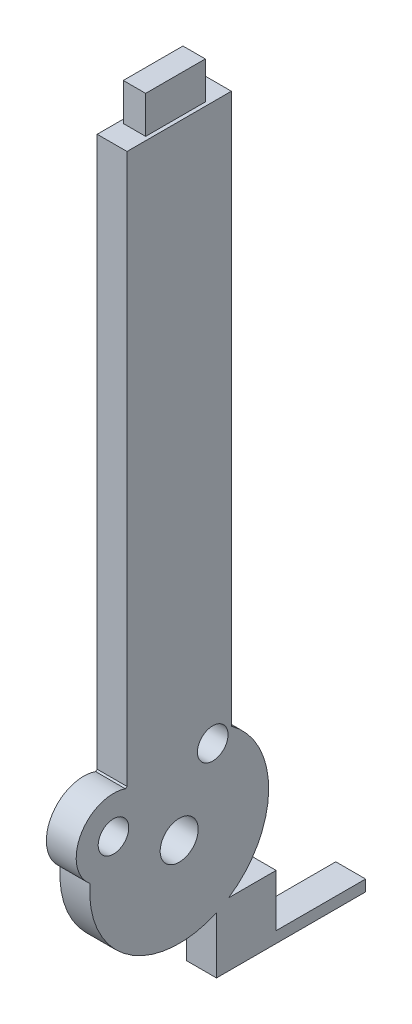
ISO-10303-21;
HEADER;
FILE_DESCRIPTION(('STEP AP214'),'2;1');
FILE_NAME('part.step','',(''),(''),'','','');
FILE_SCHEMA(('AUTOMOTIVE_DESIGN { 1 0 10303 214 1 1 1 1 }'));
ENDSEC;
DATA;
#1=APPLICATION_CONTEXT('core data for automotive mechanical design processes');
#2=APPLICATION_PROTOCOL_DEFINITION('international standard','automotive_design',2000,#1);
#3=PRODUCT_CONTEXT('',#1,'mechanical');
#4=PRODUCT('Part','Part','',(#3));
#5=PRODUCT_RELATED_PRODUCT_CATEGORY('part','',(#4));
#6=PRODUCT_DEFINITION_FORMATION('','',#4);
#7=PRODUCT_DEFINITION_CONTEXT('part definition',#1,'design');
#8=PRODUCT_DEFINITION('design','',#6,#7);
#9=PRODUCT_DEFINITION_SHAPE('','',#8);
#10=(LENGTH_UNIT() NAMED_UNIT(*) SI_UNIT(.MILLI.,.METRE.));
#11=(NAMED_UNIT(*) PLANE_ANGLE_UNIT() SI_UNIT($,.RADIAN.));
#12=(NAMED_UNIT(*) SI_UNIT($,.STERADIAN.) SOLID_ANGLE_UNIT());
#13=UNCERTAINTY_MEASURE_WITH_UNIT(LENGTH_MEASURE(1.E-05),#10,'distance_accuracy_value','');
#14=(GEOMETRIC_REPRESENTATION_CONTEXT(3) GLOBAL_UNCERTAINTY_ASSIGNED_CONTEXT((#13)) GLOBAL_UNIT_ASSIGNED_CONTEXT((#10,
#11,#12)) REPRESENTATION_CONTEXT('',''));
#15=CARTESIAN_POINT('',(0.,0.,0.));
#16=DIRECTION('',(0.,0.,1.));
#17=DIRECTION('',(1.,0.,0.));
#18=AXIS2_PLACEMENT_3D('',#15,#16,#17);
#19=CARTESIAN_POINT('',(-4.,-75.,6.));
#20=DIRECTION('',(1.,0.,0.));
#21=DIRECTION('',(0.,0.,-1.));
#22=AXIS2_PLACEMENT_3D('',#19,#20,#21);
#23=CYLINDRICAL_SURFACE('',#22,24.);
#24=DIRECTION('',(1.,0.,0.));
#25=VECTOR('',#24,1.);
#26=CARTESIAN_POINT('',(-4.,-96.8174242292714,-4.));
#27=LINE('',#26,#25);
#28=CARTESIAN_POINT('',(4.,-96.8174242292714,-4.));
#29=VERTEX_POINT('',#28);
#30=CARTESIAN_POINT('',(-4.,-96.8174242292714,-4.));
#31=VERTEX_POINT('',#30);
#32=EDGE_CURVE('E175',#29,#31,#27,.F.);
#33=ORIENTED_EDGE('',*,*,#32,.F.);
#34=CARTESIAN_POINT('',(4.,-75.,6.));
#35=DIRECTION('',(-1.,0.,0.));
#36=DIRECTION('',(0.,0.,1.));
#37=AXIS2_PLACEMENT_3D('',#34,#35,#36);
#38=CIRCLE('',#37,24.);
#39=CARTESIAN_POINT('',(4.,-73.0758093144407,29.922740022949));
#40=VERTEX_POINT('',#39);
#41=EDGE_CURVE('E192',#29,#40,#38,.T.);
#42=ORIENTED_EDGE('',*,*,#41,.T.);
#43=DIRECTION('',(1.,0.,0.));
#44=VECTOR('',#43,1.);
#45=CARTESIAN_POINT('',(0.,-73.0758093144407,29.922740022949));
#46=LINE('',#45,#44);
#47=CARTESIAN_POINT('',(-4.,-73.0758093144407,29.922740022949));
#48=VERTEX_POINT('',#47);
#49=EDGE_CURVE('E25',#48,#40,#46,.T.);
#50=ORIENTED_EDGE('',*,*,#49,.F.);
#51=CARTESIAN_POINT('',(-4.,-75.,6.));
#52=DIRECTION('',(1.,0.,0.));
#53=DIRECTION('',(0.,0.,-1.));
#54=AXIS2_PLACEMENT_3D('',#51,#52,#53);
#55=CIRCLE('',#54,24.);
#56=EDGE_CURVE('E187',#48,#31,#55,.T.);
#57=ORIENTED_EDGE('',*,*,#56,.T.);
#58=EDGE_LOOP('',(#33,#42,#50,#57));
#59=FACE_BOUND('',#58,.T.);
#60=ADVANCED_FACE('F16',(#59),#23,.T.);
#61=DIRECTION('',(1.,0.,0.));
#62=VECTOR('',#61,1.);
#63=CARTESIAN_POINT('',(-4.,-95.,-7.26649916142159));
#64=LINE('',#63,#62);
#65=CARTESIAN_POINT('',(-4.,-95.,-7.26649916142159));
#66=VERTEX_POINT('',#65);
#67=CARTESIAN_POINT('',(4.,-95.,-7.26649916142159));
#68=VERTEX_POINT('',#67);
#69=EDGE_CURVE('E173',#66,#68,#64,.T.);
#70=ORIENTED_EDGE('',*,*,#69,.F.);
#71=CARTESIAN_POINT('',(-4.,-55.5064113103821,-8.));
#72=VERTEX_POINT('',#71);
#73=EDGE_CURVE('E157',#66,#72,#55,.T.);
#74=ORIENTED_EDGE('',*,*,#73,.T.);
#75=DIRECTION('',(1.,0.,0.));
#76=VECTOR('',#75,1.);
#77=CARTESIAN_POINT('',(-4.,-55.5064113103821,-8.));
#78=LINE('',#77,#76);
#79=CARTESIAN_POINT('',(4.,-55.5064113103821,-8.00000000000001));
#80=VERTEX_POINT('',#79);
#81=EDGE_CURVE('E191',#72,#80,#78,.T.);
#82=ORIENTED_EDGE('',*,*,#81,.T.);
#83=EDGE_CURVE('E188',#80,#68,#38,.T.);
#84=ORIENTED_EDGE('',*,*,#83,.T.);
#85=EDGE_LOOP('',(#70,#74,#82,#84));
#86=FACE_BOUND('',#85,.T.);
#87=ADVANCED_FACE('F307',(#86),#23,.T.);
#88=CARTESIAN_POINT('',(0.,4.5,20.));
#89=DIRECTION('',(0.,0.,1.));
#90=DIRECTION('',(1.,0.,0.));
#91=AXIS2_PLACEMENT_3D('',#88,#89,#90);
#92=PLANE('',#91);
#93=DIRECTION('',(1.,0.,0.));
#94=VECTOR('',#93,1.);
#95=CARTESIAN_POINT('',(-4.,-55.5064113103821,20.));
#96=LINE('',#95,#94);
#97=CARTESIAN_POINT('',(4.,-55.5064113103821,20.));
#98=VERTEX_POINT('',#97);
#99=CARTESIAN_POINT('',(-4.,-55.5064113103821,20.));
#100=VERTEX_POINT('',#99);
#101=EDGE_CURVE('E195',#98,#100,#96,.F.);
#102=ORIENTED_EDGE('',*,*,#101,.F.);
#103=DIRECTION('',(0.,-1.,0.));
#104=VECTOR('',#103,1.);
#105=CARTESIAN_POINT('',(4.,4.5,20.));
#106=LINE('',#105,#104);
#107=CARTESIAN_POINT('',(4.,92.,20.));
#108=VERTEX_POINT('',#107);
#109=EDGE_CURVE('E232',#108,#98,#106,.T.);
#110=ORIENTED_EDGE('',*,*,#109,.F.);
#111=DIRECTION('',(1.,0.,0.));
#112=VECTOR('',#111,1.);
#113=CARTESIAN_POINT('',(0.,92.,20.));
#114=LINE('',#113,#112);
#115=CARTESIAN_POINT('',(-4.,92.,20.));
#116=VERTEX_POINT('',#115);
#117=EDGE_CURVE('E235',#116,#108,#114,.T.);
#118=ORIENTED_EDGE('',*,*,#117,.F.);
#119=DIRECTION('',(0.,1.,0.));
#120=VECTOR('',#119,1.);
#121=CARTESIAN_POINT('',(-4.,4.5,20.));
#122=LINE('',#121,#120);
#123=EDGE_CURVE('E237',#100,#116,#122,.T.);
#124=ORIENTED_EDGE('',*,*,#123,.F.);
#125=EDGE_LOOP('',(#102,#110,#118,#124));
#126=FACE_BOUND('',#125,.T.);
#127=ADVANCED_FACE('F18',(#126),#92,.T.);
#128=CARTESIAN_POINT('',(-4.,4.5,-8.));
#129=DIRECTION('',(-1.,0.,0.));
#130=DIRECTION('',(0.,0.,1.));
#131=AXIS2_PLACEMENT_3D('',#128,#129,#130);
#132=PLANE('',#131);
#133=CARTESIAN_POINT('',(-4.,-65.3012713173424,23.6333395005085));
#134=DIRECTION('',(-1.,0.,0.));
#135=DIRECTION('',(0.,0.,1.));
#136=AXIS2_PLACEMENT_3D('',#133,#134,#135);
#137=CIRCLE('',#136,4.1);
#138=CARTESIAN_POINT('',(-4.,-65.3012713173424,27.7333395005085));
#139=VERTEX_POINT('',#138);
#140=EDGE_CURVE('E261',#139,#139,#137,.T.);
#141=ORIENTED_EDGE('',*,*,#140,.F.);
#142=EDGE_LOOP('',(#141));
#143=FACE_BOUND('',#142,.T.);
#144=CARTESIAN_POINT('',(-4.,-57.,-3.));
#145=DIRECTION('',(-1.,0.,0.));
#146=DIRECTION('',(0.,0.,1.));
#147=AXIS2_PLACEMENT_3D('',#144,#145,#146);
#148=CIRCLE('',#147,4.1);
#149=CARTESIAN_POINT('',(-4.,-57.,1.1));
#150=VERTEX_POINT('',#149);
#151=EDGE_CURVE('E258',#150,#150,#148,.T.);
#152=ORIENTED_EDGE('',*,*,#151,.F.);
#153=EDGE_LOOP('',(#152));
#154=FACE_BOUND('',#153,.T.);
#155=CARTESIAN_POINT('',(-4.,-75.,6.));
#156=DIRECTION('',(-1.,0.,0.));
#157=DIRECTION('',(0.,0.,1.));
#158=AXIS2_PLACEMENT_3D('',#155,#156,#157);
#159=CIRCLE('',#158,5.1);
#160=CARTESIAN_POINT('',(-4.,-75.,11.1));
#161=VERTEX_POINT('',#160);
#162=EDGE_CURVE('E152',#161,#161,#159,.T.);
#163=ORIENTED_EDGE('',*,*,#162,.F.);
#164=EDGE_LOOP('',(#163));
#165=FACE_BOUND('',#164,.T.);
#166=DIRECTION('',(0.,1.,0.));
#167=VECTOR('',#166,1.);
#168=CARTESIAN_POINT('',(-4.,4.5,-20.));
#169=LINE('',#168,#167);
#170=CARTESIAN_POINT('',(-4.,-109.,-20.));
#171=VERTEX_POINT('',#170);
#172=CARTESIAN_POINT('',(-4.,-95.,-20.));
#173=VERTEX_POINT('',#172);
#174=EDGE_CURVE('E139',#171,#173,#169,.T.);
#175=ORIENTED_EDGE('',*,*,#174,.F.);
#176=DIRECTION('',(0.,0.,1.));
#177=VECTOR('',#176,1.);
#178=CARTESIAN_POINT('',(-4.,-109.,-8.));
#179=LINE('',#178,#177);
#180=CARTESIAN_POINT('',(-4.,-109.,-44.));
#181=VERTEX_POINT('',#180);
#182=EDGE_CURVE('E276',#181,#171,#179,.T.);
#183=ORIENTED_EDGE('',*,*,#182,.F.);
#184=DIRECTION('',(0.,-1.,0.));
#185=VECTOR('',#184,1.);
#186=CARTESIAN_POINT('',(-4.,-103.5,-44.));
#187=LINE('',#186,#185);
#188=CARTESIAN_POINT('',(-4.,-112.,-44.));
#189=VERTEX_POINT('',#188);
#190=EDGE_CURVE('E281',#181,#189,#187,.T.);
#191=ORIENTED_EDGE('',*,*,#190,.T.);
#192=DIRECTION('',(0.,0.,1.));
#193=VECTOR('',#192,1.);
#194=CARTESIAN_POINT('',(-4.,-112.,-44.));
#195=LINE('',#194,#193);
#196=CARTESIAN_POINT('',(-4.,-112.,-4.));
#197=VERTEX_POINT('',#196);
#198=EDGE_CURVE('E158',#189,#197,#195,.T.);
#199=ORIENTED_EDGE('',*,*,#198,.T.);
#200=DIRECTION('',(0.,1.,0.));
#201=VECTOR('',#200,1.);
#202=CARTESIAN_POINT('',(-4.,-103.5,-4.));
#203=LINE('',#202,#201);
#204=EDGE_CURVE('E168',#197,#31,#203,.T.);
#205=ORIENTED_EDGE('',*,*,#204,.T.);
#206=ORIENTED_EDGE('',*,*,#56,.F.);
#207=CARTESIAN_POINT('',(-4.,-65.3012713173424,23.6333395005085));
#208=DIRECTION('',(1.,0.,0.));
#209=DIRECTION('',(0.,0.,-1.));
#210=AXIS2_PLACEMENT_3D('',#207,#208,#209);
#211=CIRCLE('',#210,10.);
#212=CARTESIAN_POINT('',(-4.,-55.8264623660004,20.4352157793918));
#213=VERTEX_POINT('',#212);
#214=EDGE_CURVE('E178',#213,#48,#211,.T.);
#215=ORIENTED_EDGE('',*,*,#214,.F.);
#216=EDGE_CURVE('E184',#100,#213,#55,.T.);
#217=ORIENTED_EDGE('',*,*,#216,.F.);
#218=ORIENTED_EDGE('',*,*,#123,.T.);
#219=DIRECTION('',(0.,0.,1.));
#220=VECTOR('',#219,1.);
#221=CARTESIAN_POINT('',(-4.,92.,-8.));
#222=LINE('',#221,#220);
#223=CARTESIAN_POINT('',(-4.,92.,-8.));
#224=VERTEX_POINT('',#223);
#225=EDGE_CURVE('E229',#224,#116,#222,.T.);
#226=ORIENTED_EDGE('',*,*,#225,.F.);
#227=DIRECTION('',(0.,-1.,0.));
#228=VECTOR('',#227,1.);
#229=CARTESIAN_POINT('',(-4.,4.5,-8.));
#230=LINE('',#229,#228);
#231=EDGE_CURVE('E219',#224,#72,#230,.T.);
#232=ORIENTED_EDGE('',*,*,#231,.T.);
#233=ORIENTED_EDGE('',*,*,#73,.F.);
#234=DIRECTION('',(0.,0.,1.));
#235=VECTOR('',#234,1.);
#236=CARTESIAN_POINT('',(-4.,-95.,-44.));
#237=LINE('',#236,#235);
#238=EDGE_CURVE('E40',#173,#66,#237,.T.);
#239=ORIENTED_EDGE('',*,*,#238,.F.);
#240=EDGE_LOOP('',(#175,#183,#191,#199,#205,#206,#215,#217,#218,#226,#232,#233,#239));
#241=FACE_BOUND('',#240,.T.);
#242=ADVANCED_FACE('F155',(#143,#154,#165,#241),#132,.T.);
#243=CARTESIAN_POINT('',(0.,92.,-8.));
#244=DIRECTION('',(0.,1.,0.));
#245=DIRECTION('',(0.,0.,1.));
#246=AXIS2_PLACEMENT_3D('',#243,#244,#245);
#247=PLANE('',#246);
#248=DIRECTION('',(1.,0.,0.));
#249=VECTOR('',#248,1.);
#250=CARTESIAN_POINT('',(0.,92.,14.));
#251=LINE('',#250,#249);
#252=CARTESIAN_POINT('',(-3.,92.,14.));
#253=VERTEX_POINT('',#252);
#254=CARTESIAN_POINT('',(3.,92.,14.));
#255=VERTEX_POINT('',#254);
#256=EDGE_CURVE('E248',#253,#255,#251,.T.);
#257=ORIENTED_EDGE('',*,*,#256,.F.);
#258=DIRECTION('',(0.,0.,1.));
#259=VECTOR('',#258,1.);
#260=CARTESIAN_POINT('',(-3.,92.,-8.));
#261=LINE('',#260,#259);
#262=CARTESIAN_POINT('',(-3.,92.,-2.));
#263=VERTEX_POINT('',#262);
#264=EDGE_CURVE('E245',#263,#253,#261,.T.);
#265=ORIENTED_EDGE('',*,*,#264,.F.);
#266=DIRECTION('',(-1.,0.,0.));
#267=VECTOR('',#266,1.);
#268=CARTESIAN_POINT('',(0.,92.,-2.));
#269=LINE('',#268,#267);
#270=CARTESIAN_POINT('',(3.,92.,-2.));
#271=VERTEX_POINT('',#270);
#272=EDGE_CURVE('E242',#271,#263,#269,.T.);
#273=ORIENTED_EDGE('',*,*,#272,.F.);
#274=DIRECTION('',(0.,0.,-1.));
#275=VECTOR('',#274,1.);
#276=CARTESIAN_POINT('',(3.,92.,-8.));
#277=LINE('',#276,#275);
#278=EDGE_CURVE('E239',#255,#271,#277,.T.);
#279=ORIENTED_EDGE('',*,*,#278,.F.);
#280=EDGE_LOOP('',(#257,#265,#273,#279));
#281=FACE_BOUND('',#280,.T.);
#282=ORIENTED_EDGE('',*,*,#225,.T.);
#283=ORIENTED_EDGE('',*,*,#117,.T.);
#284=DIRECTION('',(0.,0.,1.));
#285=VECTOR('',#284,1.);
#286=CARTESIAN_POINT('',(4.,92.,-8.));
#287=LINE('',#286,#285);
#288=CARTESIAN_POINT('',(4.,92.,-8.));
#289=VERTEX_POINT('',#288);
#290=EDGE_CURVE('E222',#289,#108,#287,.T.);
#291=ORIENTED_EDGE('',*,*,#290,.F.);
#292=DIRECTION('',(-1.,0.,0.));
#293=VECTOR('',#292,1.);
#294=CARTESIAN_POINT('',(0.,92.,-8.));
#295=LINE('',#294,#293);
#296=EDGE_CURVE('E223',#289,#224,#295,.T.);
#297=ORIENTED_EDGE('',*,*,#296,.T.);
#298=EDGE_LOOP('',(#282,#283,#291,#297));
#299=FACE_BOUND('',#298,.T.);
#300=ADVANCED_FACE('F317',(#281,#299),#247,.T.);
#301=CARTESIAN_POINT('',(0.,4.5,-8.));
#302=DIRECTION('',(0.,0.,-1.));
#303=DIRECTION('',(-1.,0.,0.));
#304=AXIS2_PLACEMENT_3D('',#301,#302,#303);
#305=PLANE('',#304);
#306=ORIENTED_EDGE('',*,*,#81,.F.);
#307=ORIENTED_EDGE('',*,*,#231,.F.);
#308=ORIENTED_EDGE('',*,*,#296,.F.);
#309=DIRECTION('',(0.,1.,0.));
#310=VECTOR('',#309,1.);
#311=CARTESIAN_POINT('',(4.,4.5,-8.));
#312=LINE('',#311,#310);
#313=EDGE_CURVE('E220',#80,#289,#312,.T.);
#314=ORIENTED_EDGE('',*,*,#313,.F.);
#315=EDGE_LOOP('',(#306,#307,#308,#314));
#316=FACE_BOUND('',#315,.T.);
#317=ADVANCED_FACE('F311',(#316),#305,.T.);
#318=CARTESIAN_POINT('',(4.,4.5,-8.));
#319=DIRECTION('',(1.,0.,0.));
#320=DIRECTION('',(0.,0.,-1.));
#321=AXIS2_PLACEMENT_3D('',#318,#319,#320);
#322=PLANE('',#321);
#323=CARTESIAN_POINT('',(4.,-65.3012713173424,23.6333395005085));
#324=DIRECTION('',(1.,0.,0.));
#325=DIRECTION('',(0.,0.,-1.));
#326=AXIS2_PLACEMENT_3D('',#323,#324,#325);
#327=CIRCLE('',#326,4.1);
#328=CARTESIAN_POINT('',(4.,-65.3012713173424,19.5333395005085));
#329=VERTEX_POINT('',#328);
#330=EDGE_CURVE('E20',#329,#329,#327,.T.);
#331=ORIENTED_EDGE('',*,*,#330,.F.);
#332=EDGE_LOOP('',(#331));
#333=FACE_BOUND('',#332,.T.);
#334=CARTESIAN_POINT('',(4.,-57.,-3.));
#335=DIRECTION('',(1.,0.,0.));
#336=DIRECTION('',(0.,0.,-1.));
#337=AXIS2_PLACEMENT_3D('',#334,#335,#336);
#338=CIRCLE('',#337,4.1);
#339=CARTESIAN_POINT('',(4.,-57.,-7.1));
#340=VERTEX_POINT('',#339);
#341=EDGE_CURVE('E259',#340,#340,#338,.T.);
#342=ORIENTED_EDGE('',*,*,#341,.F.);
#343=EDGE_LOOP('',(#342));
#344=FACE_BOUND('',#343,.T.);
#345=CARTESIAN_POINT('',(4.,-75.,6.));
#346=DIRECTION('',(1.,0.,0.));
#347=DIRECTION('',(0.,0.,-1.));
#348=AXIS2_PLACEMENT_3D('',#345,#346,#347);
#349=CIRCLE('',#348,5.1);
#350=CARTESIAN_POINT('',(4.,-75.,0.900000000000001));
#351=VERTEX_POINT('',#350);
#352=EDGE_CURVE('E256',#351,#351,#349,.T.);
#353=ORIENTED_EDGE('',*,*,#352,.F.);
#354=EDGE_LOOP('',(#353));
#355=FACE_BOUND('',#354,.T.);
#356=DIRECTION('',(0.,-1.,0.));
#357=VECTOR('',#356,1.);
#358=CARTESIAN_POINT('',(4.,4.5,-20.));
#359=LINE('',#358,#357);
#360=CARTESIAN_POINT('',(4.,-95.,-20.));
#361=VERTEX_POINT('',#360);
#362=CARTESIAN_POINT('',(4.,-109.,-20.));
#363=VERTEX_POINT('',#362);
#364=EDGE_CURVE('E147',#361,#363,#359,.T.);
#365=ORIENTED_EDGE('',*,*,#364,.F.);
#366=DIRECTION('',(0.,0.,1.));
#367=VECTOR('',#366,1.);
#368=CARTESIAN_POINT('',(4.,-95.,-44.));
#369=LINE('',#368,#367);
#370=EDGE_CURVE('E151',#361,#68,#369,.T.);
#371=ORIENTED_EDGE('',*,*,#370,.T.);
#372=ORIENTED_EDGE('',*,*,#83,.F.);
#373=ORIENTED_EDGE('',*,*,#313,.T.);
#374=ORIENTED_EDGE('',*,*,#290,.T.);
#375=ORIENTED_EDGE('',*,*,#109,.T.);
#376=CARTESIAN_POINT('',(4.,-55.8264623660004,20.4352157793918));
#377=VERTEX_POINT('',#376);
#378=EDGE_CURVE('E186',#377,#98,#38,.T.);
#379=ORIENTED_EDGE('',*,*,#378,.F.);
#380=CARTESIAN_POINT('',(4.,-65.3012713173424,23.6333395005085));
#381=DIRECTION('',(-1.,0.,0.));
#382=DIRECTION('',(0.,0.,1.));
#383=AXIS2_PLACEMENT_3D('',#380,#381,#382);
#384=CIRCLE('',#383,10.);
#385=EDGE_CURVE('E181',#40,#377,#384,.T.);
#386=ORIENTED_EDGE('',*,*,#385,.F.);
#387=ORIENTED_EDGE('',*,*,#41,.F.);
#388=DIRECTION('',(0.,-1.,0.));
#389=VECTOR('',#388,1.);
#390=CARTESIAN_POINT('',(4.,-103.5,-4.));
#391=LINE('',#390,#389);
#392=CARTESIAN_POINT('',(4.,-112.,-4.));
#393=VERTEX_POINT('',#392);
#394=EDGE_CURVE('E161',#29,#393,#391,.T.);
#395=ORIENTED_EDGE('',*,*,#394,.T.);
#396=DIRECTION('',(0.,0.,1.));
#397=VECTOR('',#396,1.);
#398=CARTESIAN_POINT('',(4.,-112.,-44.));
#399=LINE('',#398,#397);
#400=CARTESIAN_POINT('',(4.,-112.,-44.));
#401=VERTEX_POINT('',#400);
#402=EDGE_CURVE('E163',#401,#393,#399,.T.);
#403=ORIENTED_EDGE('',*,*,#402,.F.);
#404=DIRECTION('',(0.,1.,0.));
#405=VECTOR('',#404,1.);
#406=CARTESIAN_POINT('',(4.,-103.5,-44.));
#407=LINE('',#406,#405);
#408=CARTESIAN_POINT('',(4.,-109.,-44.));
#409=VERTEX_POINT('',#408);
#410=EDGE_CURVE('E282',#401,#409,#407,.T.);
#411=ORIENTED_EDGE('',*,*,#410,.T.);
#412=DIRECTION('',(0.,0.,-1.));
#413=VECTOR('',#412,1.);
#414=CARTESIAN_POINT('',(4.,-109.,-8.));
#415=LINE('',#414,#413);
#416=EDGE_CURVE('E32',#363,#409,#415,.T.);
#417=ORIENTED_EDGE('',*,*,#416,.F.);
#418=EDGE_LOOP('',(#365,#371,#372,#373,#374,#375,#379,#386,#387,#395,#403,#411,#417));
#419=FACE_BOUND('',#418,.T.);
#420=ADVANCED_FACE('F294',(#333,#344,#355,#419),#322,.T.);
#421=CARTESIAN_POINT('',(0.,93.5,14.));
#422=DIRECTION('',(0.,0.,1.));
#423=DIRECTION('',(1.,0.,0.));
#424=AXIS2_PLACEMENT_3D('',#421,#422,#423);
#425=PLANE('',#424);
#426=DIRECTION('',(0.,1.,0.));
#427=VECTOR('',#426,1.);
#428=CARTESIAN_POINT('',(-3.,93.5,14.));
#429=LINE('',#428,#427);
#430=CARTESIAN_POINT('',(-3.,102.,14.));
#431=VERTEX_POINT('',#430);
#432=EDGE_CURVE('E217',#253,#431,#429,.T.);
#433=ORIENTED_EDGE('',*,*,#432,.F.);
#434=ORIENTED_EDGE('',*,*,#256,.T.);
#435=DIRECTION('',(0.,-1.,0.));
#436=VECTOR('',#435,1.);
#437=CARTESIAN_POINT('',(3.,93.5,14.));
#438=LINE('',#437,#436);
#439=CARTESIAN_POINT('',(3.,102.,14.));
#440=VERTEX_POINT('',#439);
#441=EDGE_CURVE('E212',#440,#255,#438,.T.);
#442=ORIENTED_EDGE('',*,*,#441,.F.);
#443=DIRECTION('',(1.,0.,0.));
#444=VECTOR('',#443,1.);
#445=CARTESIAN_POINT('',(0.,102.,14.));
#446=LINE('',#445,#444);
#447=EDGE_CURVE('E215',#431,#440,#446,.T.);
#448=ORIENTED_EDGE('',*,*,#447,.F.);
#449=EDGE_LOOP('',(#433,#434,#442,#448));
#450=FACE_BOUND('',#449,.T.);
#451=ADVANCED_FACE('F357',(#450),#425,.T.);
#452=CARTESIAN_POINT('',(-3.,93.5,-2.));
#453=DIRECTION('',(-1.,0.,0.));
#454=DIRECTION('',(0.,0.,1.));
#455=AXIS2_PLACEMENT_3D('',#452,#453,#454);
#456=PLANE('',#455);
#457=DIRECTION('',(0.,-1.,0.));
#458=VECTOR('',#457,1.);
#459=CARTESIAN_POINT('',(-3.,93.5,-2.));
#460=LINE('',#459,#458);
#461=CARTESIAN_POINT('',(-3.,102.,-2.));
#462=VERTEX_POINT('',#461);
#463=EDGE_CURVE('E198',#462,#263,#460,.T.);
#464=ORIENTED_EDGE('',*,*,#463,.T.);
#465=ORIENTED_EDGE('',*,*,#264,.T.);
#466=ORIENTED_EDGE('',*,*,#432,.T.);
#467=DIRECTION('',(0.,0.,1.));
#468=VECTOR('',#467,1.);
#469=CARTESIAN_POINT('',(-3.,102.,-2.));
#470=LINE('',#469,#468);
#471=EDGE_CURVE('E209',#462,#431,#470,.T.);
#472=ORIENTED_EDGE('',*,*,#471,.F.);
#473=EDGE_LOOP('',(#464,#465,#466,#472));
#474=FACE_BOUND('',#473,.T.);
#475=ADVANCED_FACE('F353',(#474),#456,.T.);
#476=CARTESIAN_POINT('',(0.,102.,-2.));
#477=DIRECTION('',(0.,1.,0.));
#478=DIRECTION('',(0.,0.,1.));
#479=AXIS2_PLACEMENT_3D('',#476,#477,#478);
#480=PLANE('',#479);
#481=ORIENTED_EDGE('',*,*,#471,.T.);
#482=ORIENTED_EDGE('',*,*,#447,.T.);
#483=DIRECTION('',(0.,0.,1.));
#484=VECTOR('',#483,1.);
#485=CARTESIAN_POINT('',(3.,102.,-2.));
#486=LINE('',#485,#484);
#487=CARTESIAN_POINT('',(3.,102.,-2.));
#488=VERTEX_POINT('',#487);
#489=EDGE_CURVE('E201',#488,#440,#486,.T.);
#490=ORIENTED_EDGE('',*,*,#489,.F.);
#491=DIRECTION('',(-1.,0.,0.));
#492=VECTOR('',#491,1.);
#493=CARTESIAN_POINT('',(0.,102.,-2.));
#494=LINE('',#493,#492);
#495=EDGE_CURVE('E202',#488,#462,#494,.T.);
#496=ORIENTED_EDGE('',*,*,#495,.T.);
#497=EDGE_LOOP('',(#481,#482,#490,#496));
#498=FACE_BOUND('',#497,.T.);
#499=ADVANCED_FACE('F348',(#498),#480,.T.);
#500=CARTESIAN_POINT('',(0.,93.5,-2.));
#501=DIRECTION('',(0.,0.,-1.));
#502=DIRECTION('',(-1.,0.,0.));
#503=AXIS2_PLACEMENT_3D('',#500,#501,#502);
#504=PLANE('',#503);
#505=DIRECTION('',(0.,1.,0.));
#506=VECTOR('',#505,1.);
#507=CARTESIAN_POINT('',(3.,93.5,-2.));
#508=LINE('',#507,#506);
#509=EDGE_CURVE('E199',#271,#488,#508,.T.);
#510=ORIENTED_EDGE('',*,*,#509,.F.);
#511=ORIENTED_EDGE('',*,*,#272,.T.);
#512=ORIENTED_EDGE('',*,*,#463,.F.);
#513=ORIENTED_EDGE('',*,*,#495,.F.);
#514=EDGE_LOOP('',(#510,#511,#512,#513));
#515=FACE_BOUND('',#514,.T.);
#516=ADVANCED_FACE('F342',(#515),#504,.T.);
#517=CARTESIAN_POINT('',(3.,93.5,-2.));
#518=DIRECTION('',(1.,0.,0.));
#519=DIRECTION('',(0.,0.,-1.));
#520=AXIS2_PLACEMENT_3D('',#517,#518,#519);
#521=PLANE('',#520);
#522=ORIENTED_EDGE('',*,*,#441,.T.);
#523=ORIENTED_EDGE('',*,*,#278,.T.);
#524=ORIENTED_EDGE('',*,*,#509,.T.);
#525=ORIENTED_EDGE('',*,*,#489,.T.);
#526=EDGE_LOOP('',(#522,#523,#524,#525));
#527=FACE_BOUND('',#526,.T.);
#528=ADVANCED_FACE('F337',(#527),#521,.T.);
#529=DIRECTION('',(1.,0.,0.));
#530=VECTOR('',#529,1.);
#531=CARTESIAN_POINT('',(0.,-55.8264623660004,20.4352157793918));
#532=LINE('',#531,#530);
#533=EDGE_CURVE('E251',#377,#213,#532,.F.);
#534=ORIENTED_EDGE('',*,*,#533,.F.);
#535=ORIENTED_EDGE('',*,*,#378,.T.);
#536=ORIENTED_EDGE('',*,*,#101,.T.);
#537=ORIENTED_EDGE('',*,*,#216,.T.);
#538=EDGE_LOOP('',(#534,#535,#536,#537));
#539=FACE_BOUND('',#538,.T.);
#540=ADVANCED_FACE('F323',(#539),#23,.T.);
#541=CARTESIAN_POINT('',(-4.,-65.3012713173424,23.6333395005085));
#542=DIRECTION('',(1.,0.,0.));
#543=DIRECTION('',(0.,0.,-1.));
#544=AXIS2_PLACEMENT_3D('',#541,#542,#543);
#545=CYLINDRICAL_SURFACE('',#544,10.);
#546=ORIENTED_EDGE('',*,*,#214,.T.);
#547=ORIENTED_EDGE('',*,*,#49,.T.);
#548=ORIENTED_EDGE('',*,*,#385,.T.);
#549=ORIENTED_EDGE('',*,*,#533,.T.);
#550=EDGE_LOOP('',(#546,#547,#548,#549));
#551=FACE_BOUND('',#550,.T.);
#552=ADVANCED_FACE('F326',(#551),#545,.T.);
#553=CARTESIAN_POINT('',(0.,-103.5,-4.));
#554=DIRECTION('',(0.,0.,1.));
#555=DIRECTION('',(1.,0.,0.));
#556=AXIS2_PLACEMENT_3D('',#553,#554,#555);
#557=PLANE('',#556);
#558=ORIENTED_EDGE('',*,*,#394,.F.);
#559=ORIENTED_EDGE('',*,*,#32,.T.);
#560=ORIENTED_EDGE('',*,*,#204,.F.);
#561=DIRECTION('',(-1.,0.,0.));
#562=VECTOR('',#561,1.);
#563=CARTESIAN_POINT('',(0.,-112.,-4.));
#564=LINE('',#563,#562);
#565=EDGE_CURVE('E171',#393,#197,#564,.T.);
#566=ORIENTED_EDGE('',*,*,#565,.F.);
#567=EDGE_LOOP('',(#558,#559,#560,#566));
#568=FACE_BOUND('',#567,.T.);
#569=ADVANCED_FACE('F299',(#568),#557,.T.);
#570=CARTESIAN_POINT('',(0.,-112.,-44.));
#571=DIRECTION('',(0.,-1.,0.));
#572=DIRECTION('',(0.,0.,-1.));
#573=AXIS2_PLACEMENT_3D('',#570,#571,#572);
#574=PLANE('',#573);
#575=ORIENTED_EDGE('',*,*,#402,.T.);
#576=ORIENTED_EDGE('',*,*,#565,.T.);
#577=ORIENTED_EDGE('',*,*,#198,.F.);
#578=DIRECTION('',(1.,0.,0.));
#579=VECTOR('',#578,1.);
#580=CARTESIAN_POINT('',(0.,-112.,-44.));
#581=LINE('',#580,#579);
#582=EDGE_CURVE('E146',#189,#401,#581,.T.);
#583=ORIENTED_EDGE('',*,*,#582,.T.);
#584=EDGE_LOOP('',(#575,#576,#577,#583));
#585=FACE_BOUND('',#584,.T.);
#586=ADVANCED_FACE('F287',(#585),#574,.T.);
#587=CARTESIAN_POINT('',(0.,-95.,-44.));
#588=DIRECTION('',(0.,1.,0.));
#589=DIRECTION('',(0.,0.,1.));
#590=AXIS2_PLACEMENT_3D('',#587,#588,#589);
#591=PLANE('',#590);
#592=DIRECTION('',(1.,0.,0.));
#593=VECTOR('',#592,1.);
#594=CARTESIAN_POINT('',(0.,-95.,-20.));
#595=LINE('',#594,#593);
#596=EDGE_CURVE('E141',#173,#361,#595,.T.);
#597=ORIENTED_EDGE('',*,*,#596,.F.);
#598=ORIENTED_EDGE('',*,*,#238,.T.);
#599=ORIENTED_EDGE('',*,*,#69,.T.);
#600=ORIENTED_EDGE('',*,*,#370,.F.);
#601=EDGE_LOOP('',(#597,#598,#599,#600));
#602=FACE_BOUND('',#601,.T.);
#603=ADVANCED_FACE('F150',(#602),#591,.T.);
#604=CARTESIAN_POINT('',(0.,-103.5,-44.));
#605=DIRECTION('',(0.,0.,-1.));
#606=DIRECTION('',(-1.,0.,0.));
#607=AXIS2_PLACEMENT_3D('',#604,#605,#606);
#608=PLANE('',#607);
#609=DIRECTION('',(-1.,0.,0.));
#610=VECTOR('',#609,1.);
#611=CARTESIAN_POINT('',(0.,-109.,-44.));
#612=LINE('',#611,#610);
#613=EDGE_CURVE('E10',#409,#181,#612,.T.);
#614=ORIENTED_EDGE('',*,*,#613,.F.);
#615=ORIENTED_EDGE('',*,*,#410,.F.);
#616=ORIENTED_EDGE('',*,*,#582,.F.);
#617=ORIENTED_EDGE('',*,*,#190,.F.);
#618=EDGE_LOOP('',(#614,#615,#616,#617));
#619=FACE_BOUND('',#618,.T.);
#620=ADVANCED_FACE('F303',(#619),#608,.T.);
#621=CARTESIAN_POINT('',(0.,-102.,-20.));
#622=DIRECTION('',(0.,0.,1.));
#623=DIRECTION('',(1.,0.,0.));
#624=AXIS2_PLACEMENT_3D('',#621,#622,#623);
#625=PLANE('',#624);
#626=ORIENTED_EDGE('',*,*,#174,.T.);
#627=ORIENTED_EDGE('',*,*,#596,.T.);
#628=ORIENTED_EDGE('',*,*,#364,.T.);
#629=DIRECTION('',(-1.,0.,0.));
#630=VECTOR('',#629,1.);
#631=CARTESIAN_POINT('',(0.,-109.,-20.));
#632=LINE('',#631,#630);
#633=EDGE_CURVE('E143',#363,#171,#632,.T.);
#634=ORIENTED_EDGE('',*,*,#633,.T.);
#635=EDGE_LOOP('',(#626,#627,#628,#634));
#636=FACE_BOUND('',#635,.T.);
#637=ADVANCED_FACE('F140',(#636),#625,.F.);
#638=CARTESIAN_POINT('',(0.,-109.,-44.));
#639=DIRECTION('',(0.,-1.,0.));
#640=DIRECTION('',(0.,0.,-1.));
#641=AXIS2_PLACEMENT_3D('',#638,#639,#640);
#642=PLANE('',#641);
#643=ORIENTED_EDGE('',*,*,#182,.T.);
#644=ORIENTED_EDGE('',*,*,#633,.F.);
#645=ORIENTED_EDGE('',*,*,#416,.T.);
#646=ORIENTED_EDGE('',*,*,#613,.T.);
#647=EDGE_LOOP('',(#643,#644,#645,#646));
#648=FACE_BOUND('',#647,.T.);
#649=ADVANCED_FACE('F304',(#648),#642,.F.);
#650=CARTESIAN_POINT('',(-4.3,-75.,6.));
#651=DIRECTION('',(1.,0.,0.));
#652=DIRECTION('',(0.,0.,-1.));
#653=AXIS2_PLACEMENT_3D('',#650,#651,#652);
#654=CYLINDRICAL_SURFACE('',#653,5.1);
#655=ORIENTED_EDGE('',*,*,#162,.T.);
#656=EDGE_LOOP('',(#655));
#657=FACE_BOUND('',#656,.T.);
#658=ORIENTED_EDGE('',*,*,#352,.T.);
#659=EDGE_LOOP('',(#658));
#660=FACE_BOUND('',#659,.T.);
#661=ADVANCED_FACE('F379',(#657,#660),#654,.F.);
#662=CARTESIAN_POINT('',(-4.3,-57.,-3.));
#663=DIRECTION('',(1.,0.,0.));
#664=DIRECTION('',(0.,0.,-1.));
#665=AXIS2_PLACEMENT_3D('',#662,#663,#664);
#666=CYLINDRICAL_SURFACE('',#665,4.1);
#667=ORIENTED_EDGE('',*,*,#151,.T.);
#668=EDGE_LOOP('',(#667));
#669=FACE_BOUND('',#668,.T.);
#670=ORIENTED_EDGE('',*,*,#341,.T.);
#671=EDGE_LOOP('',(#670));
#672=FACE_BOUND('',#671,.T.);
#673=ADVANCED_FACE('F382',(#669,#672),#666,.F.);
#674=CARTESIAN_POINT('',(-4.3,-65.3012713173424,23.6333395005085));
#675=DIRECTION('',(1.,0.,0.));
#676=DIRECTION('',(0.,0.,-1.));
#677=AXIS2_PLACEMENT_3D('',#674,#675,#676);
#678=CYLINDRICAL_SURFACE('',#677,4.1);
#679=ORIENTED_EDGE('',*,*,#140,.T.);
#680=EDGE_LOOP('',(#679));
#681=FACE_BOUND('',#680,.T.);
#682=ORIENTED_EDGE('',*,*,#330,.T.);
#683=EDGE_LOOP('',(#682));
#684=FACE_BOUND('',#683,.T.);
#685=ADVANCED_FACE('F390',(#681,#684),#678,.F.);
#686=CLOSED_SHELL('',(#60,#87,#127,#242,#300,#317,#420,#451,#475,#499,#516,#528,#540,#552,#569,
#586,#603,#620,#637,#649,#661,#673,#685));
#687=MANIFOLD_SOLID_BREP('B1',#686);
#688=ADVANCED_BREP_SHAPE_REPRESENTATION('',(#18,#687),#14);
#689=SHAPE_DEFINITION_REPRESENTATION(#9,#688);
ENDSEC;
END-ISO-10303-21;
